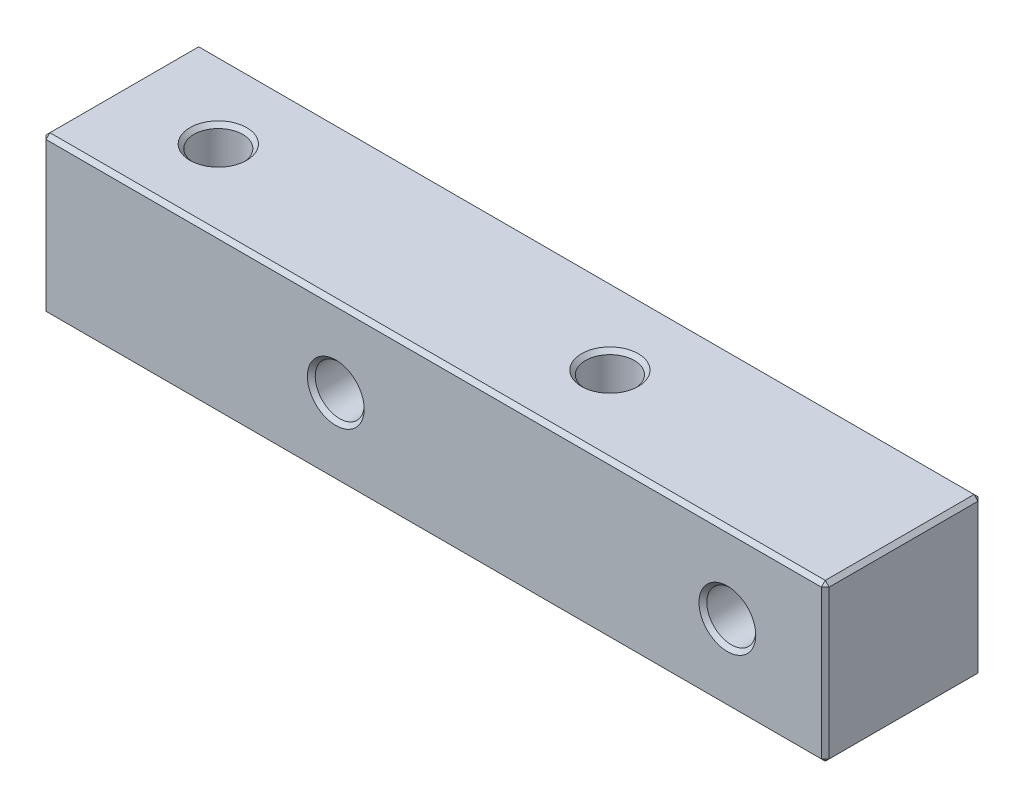
ISO-10303-21;
HEADER;
FILE_DESCRIPTION(('STEP AP214'),'2;1');
FILE_NAME('part.step','',(''),(''),'','','');
FILE_SCHEMA(('AUTOMOTIVE_DESIGN { 1 0 10303 214 1 1 1 1 }'));
ENDSEC;
DATA;
#1=APPLICATION_CONTEXT('core data for automotive mechanical design processes');
#2=APPLICATION_PROTOCOL_DEFINITION('international standard','automotive_design',2000,#1);
#3=PRODUCT_CONTEXT('',#1,'mechanical');
#4=PRODUCT('Part','Part','',(#3));
#5=PRODUCT_RELATED_PRODUCT_CATEGORY('part','',(#4));
#6=PRODUCT_DEFINITION_FORMATION('','',#4);
#7=PRODUCT_DEFINITION_CONTEXT('part definition',#1,'design');
#8=PRODUCT_DEFINITION('design','',#6,#7);
#9=PRODUCT_DEFINITION_SHAPE('','',#8);
#10=(LENGTH_UNIT() NAMED_UNIT(*) SI_UNIT(.MILLI.,.METRE.));
#11=(NAMED_UNIT(*) PLANE_ANGLE_UNIT() SI_UNIT($,.RADIAN.));
#12=(NAMED_UNIT(*) SI_UNIT($,.STERADIAN.) SOLID_ANGLE_UNIT());
#13=UNCERTAINTY_MEASURE_WITH_UNIT(LENGTH_MEASURE(1.E-05),#10,'distance_accuracy_value','');
#14=(GEOMETRIC_REPRESENTATION_CONTEXT(3) GLOBAL_UNCERTAINTY_ASSIGNED_CONTEXT((#13)) GLOBAL_UNIT_ASSIGNED_CONTEXT((#10,
#11,#12)) REPRESENTATION_CONTEXT('',''));
#15=CARTESIAN_POINT('',(0.,0.,0.));
#16=DIRECTION('',(0.,0.,1.));
#17=DIRECTION('',(1.,0.,0.));
#18=AXIS2_PLACEMENT_3D('',#15,#16,#17);
#19=CARTESIAN_POINT('',(20.,4.,-4.));
#20=DIRECTION('',(-1.,0.,0.));
#21=DIRECTION('',(0.,0.,1.));
#22=AXIS2_PLACEMENT_3D('',#19,#20,#21);
#23=PLANE('',#22);
#24=DIRECTION('',(0.,-1.,0.));
#25=VECTOR('',#24,1.);
#26=CARTESIAN_POINT('',(20.,4.,3.8));
#27=LINE('',#26,#25);
#28=CARTESIAN_POINT('',(20.,3.8,3.8));
#29=VERTEX_POINT('',#28);
#30=CARTESIAN_POINT('',(20.,-3.8,3.8));
#31=VERTEX_POINT('',#30);
#32=EDGE_CURVE('E241',#29,#31,#27,.T.);
#33=ORIENTED_EDGE('',*,*,#32,.T.);
#34=DIRECTION('',(0.,0.,-1.));
#35=VECTOR('',#34,1.);
#36=CARTESIAN_POINT('',(20.,-3.8,-4.));
#37=LINE('',#36,#35);
#38=CARTESIAN_POINT('',(20.,-3.8,-3.8));
#39=VERTEX_POINT('',#38);
#40=EDGE_CURVE('E243',#31,#39,#37,.T.);
#41=ORIENTED_EDGE('',*,*,#40,.T.);
#42=DIRECTION('',(0.,1.,0.));
#43=VECTOR('',#42,1.);
#44=CARTESIAN_POINT('',(20.,4.,-3.8));
#45=LINE('',#44,#43);
#46=CARTESIAN_POINT('',(20.,3.8,-3.8));
#47=VERTEX_POINT('',#46);
#48=EDGE_CURVE('E237',#39,#47,#45,.T.);
#49=ORIENTED_EDGE('',*,*,#48,.T.);
#50=DIRECTION('',(0.,0.,1.));
#51=VECTOR('',#50,1.);
#52=CARTESIAN_POINT('',(20.,3.8,4.));
#53=LINE('',#52,#51);
#54=EDGE_CURVE('E239',#47,#29,#53,.T.);
#55=ORIENTED_EDGE('',*,*,#54,.T.);
#56=EDGE_LOOP('',(#33,#41,#49,#55));
#57=FACE_BOUND('',#56,.T.);
#58=ADVANCED_FACE('F41',(#57),#23,.F.);
#59=CARTESIAN_POINT('',(-20.,4.,-4.));
#60=DIRECTION('',(0.,0.,1.));
#61=DIRECTION('',(1.,0.,0.));
#62=AXIS2_PLACEMENT_3D('',#59,#60,#61);
#63=PLANE('',#62);
#64=DIRECTION('',(1.,0.,0.));
#65=VECTOR('',#64,1.);
#66=CARTESIAN_POINT('',(20.,3.8,-4.));
#67=LINE('',#66,#65);
#68=CARTESIAN_POINT('',(-19.8,3.8,-4.));
#69=VERTEX_POINT('',#68);
#70=CARTESIAN_POINT('',(19.8,3.8,-4.));
#71=VERTEX_POINT('',#70);
#72=EDGE_CURVE('E51',#69,#71,#67,.T.);
#73=ORIENTED_EDGE('',*,*,#72,.T.);
#74=DIRECTION('',(0.,-1.,0.));
#75=VECTOR('',#74,1.);
#76=CARTESIAN_POINT('',(19.8,4.,-4.));
#77=LINE('',#76,#75);
#78=CARTESIAN_POINT('',(19.8,-3.8,-4.));
#79=VERTEX_POINT('',#78);
#80=EDGE_CURVE('E11',#71,#79,#77,.T.);
#81=ORIENTED_EDGE('',*,*,#80,.T.);
#82=DIRECTION('',(-1.,0.,0.));
#83=VECTOR('',#82,1.);
#84=CARTESIAN_POINT('',(-20.,-3.8,-4.));
#85=LINE('',#84,#83);
#86=CARTESIAN_POINT('',(-19.8,-3.8,-4.));
#87=VERTEX_POINT('',#86);
#88=EDGE_CURVE('E252',#79,#87,#85,.T.);
#89=ORIENTED_EDGE('',*,*,#88,.T.);
#90=DIRECTION('',(0.,1.,0.));
#91=VECTOR('',#90,1.);
#92=CARTESIAN_POINT('',(-19.8,4.,-4.));
#93=LINE('',#92,#91);
#94=EDGE_CURVE('E62',#87,#69,#93,.T.);
#95=ORIENTED_EDGE('',*,*,#94,.T.);
#96=EDGE_LOOP('',(#73,#81,#89,#95));
#97=FACE_BOUND('',#96,.T.);
#98=CARTESIAN_POINT('',(-5.,0.,-4.));
#99=DIRECTION('',(0.,0.,1.));
#100=DIRECTION('',(1.,0.,0.));
#101=AXIS2_PLACEMENT_3D('',#98,#99,#100);
#102=CIRCLE('',#101,1.44999999999999);
#103=CARTESIAN_POINT('',(-3.55000000000001,0.,-4.));
#104=VERTEX_POINT('',#103);
#105=EDGE_CURVE('E249',#104,#104,#102,.T.);
#106=ORIENTED_EDGE('',*,*,#105,.T.);
#107=EDGE_LOOP('',(#106));
#108=FACE_BOUND('',#107,.T.);
#109=CARTESIAN_POINT('',(15.,0.,-4.));
#110=DIRECTION('',(0.,0.,1.));
#111=DIRECTION('',(1.,0.,0.));
#112=AXIS2_PLACEMENT_3D('',#109,#110,#111);
#113=CIRCLE('',#112,1.44999999999999);
#114=CARTESIAN_POINT('',(16.45,0.,-4.));
#115=VERTEX_POINT('',#114);
#116=EDGE_CURVE('E246',#115,#115,#113,.T.);
#117=ORIENTED_EDGE('',*,*,#116,.T.);
#118=EDGE_LOOP('',(#117));
#119=FACE_BOUND('',#118,.T.);
#120=ADVANCED_FACE('F324',(#97,#108,#119),#63,.F.);
#121=CARTESIAN_POINT('',(-20.,4.,-4.));
#122=DIRECTION('',(1.,0.,0.));
#123=DIRECTION('',(0.,0.,-1.));
#124=AXIS2_PLACEMENT_3D('',#121,#122,#123);
#125=PLANE('',#124);
#126=DIRECTION('',(0.,-1.,0.));
#127=VECTOR('',#126,1.);
#128=CARTESIAN_POINT('',(-20.,4.,-3.8));
#129=LINE('',#128,#127);
#130=CARTESIAN_POINT('',(-20.,3.8,-3.8));
#131=VERTEX_POINT('',#130);
#132=CARTESIAN_POINT('',(-20.,-3.8,-3.8));
#133=VERTEX_POINT('',#132);
#134=EDGE_CURVE('E230',#131,#133,#129,.T.);
#135=ORIENTED_EDGE('',*,*,#134,.T.);
#136=DIRECTION('',(0.,0.,1.));
#137=VECTOR('',#136,1.);
#138=CARTESIAN_POINT('',(-20.,-3.8,-4.));
#139=LINE('',#138,#137);
#140=CARTESIAN_POINT('',(-20.,-3.8,3.8));
#141=VERTEX_POINT('',#140);
#142=EDGE_CURVE('E138',#133,#141,#139,.T.);
#143=ORIENTED_EDGE('',*,*,#142,.T.);
#144=DIRECTION('',(0.,1.,0.));
#145=VECTOR('',#144,1.);
#146=CARTESIAN_POINT('',(-20.,4.,3.8));
#147=LINE('',#146,#145);
#148=CARTESIAN_POINT('',(-20.,3.8,3.8));
#149=VERTEX_POINT('',#148);
#150=EDGE_CURVE('E234',#141,#149,#147,.T.);
#151=ORIENTED_EDGE('',*,*,#150,.T.);
#152=DIRECTION('',(0.,0.,-1.));
#153=VECTOR('',#152,1.);
#154=CARTESIAN_POINT('',(-20.,3.8,-4.));
#155=LINE('',#154,#153);
#156=EDGE_CURVE('E232',#149,#131,#155,.T.);
#157=ORIENTED_EDGE('',*,*,#156,.T.);
#158=EDGE_LOOP('',(#135,#143,#151,#157));
#159=FACE_BOUND('',#158,.T.);
#160=ADVANCED_FACE('F381',(#159),#125,.F.);
#161=CARTESIAN_POINT('',(-20.,4.,4.));
#162=DIRECTION('',(0.,0.,-1.));
#163=DIRECTION('',(-1.,0.,0.));
#164=AXIS2_PLACEMENT_3D('',#161,#162,#163);
#165=PLANE('',#164);
#166=CARTESIAN_POINT('',(-5.,0.,4.));
#167=DIRECTION('',(0.,0.,-1.));
#168=DIRECTION('',(-1.,0.,0.));
#169=AXIS2_PLACEMENT_3D('',#166,#167,#168);
#170=CIRCLE('',#169,1.45);
#171=CARTESIAN_POINT('',(-6.45,0.,4.));
#172=VERTEX_POINT('',#171);
#173=EDGE_CURVE('E200',#172,#172,#170,.T.);
#174=ORIENTED_EDGE('',*,*,#173,.T.);
#175=EDGE_LOOP('',(#174));
#176=FACE_BOUND('',#175,.T.);
#177=CARTESIAN_POINT('',(15.,0.,4.));
#178=DIRECTION('',(0.,0.,-1.));
#179=DIRECTION('',(-1.,0.,0.));
#180=AXIS2_PLACEMENT_3D('',#177,#178,#179);
#181=CIRCLE('',#180,1.44999999999999);
#182=CARTESIAN_POINT('',(16.45,0.,4.));
#183=VERTEX_POINT('',#182);
#184=EDGE_CURVE('E197',#183,#183,#181,.T.);
#185=ORIENTED_EDGE('',*,*,#184,.T.);
#186=EDGE_LOOP('',(#185));
#187=FACE_BOUND('',#186,.T.);
#188=DIRECTION('',(-1.,0.,0.));
#189=VECTOR('',#188,1.);
#190=CARTESIAN_POINT('',(-20.,3.8,4.));
#191=LINE('',#190,#189);
#192=CARTESIAN_POINT('',(19.8,3.8,4.));
#193=VERTEX_POINT('',#192);
#194=CARTESIAN_POINT('',(-19.8,3.8,4.));
#195=VERTEX_POINT('',#194);
#196=EDGE_CURVE('E188',#193,#195,#191,.T.);
#197=ORIENTED_EDGE('',*,*,#196,.T.);
#198=DIRECTION('',(0.,-1.,0.));
#199=VECTOR('',#198,1.);
#200=CARTESIAN_POINT('',(-19.8,4.,4.));
#201=LINE('',#200,#199);
#202=CARTESIAN_POINT('',(-19.8,-3.8,4.));
#203=VERTEX_POINT('',#202);
#204=EDGE_CURVE('E194',#195,#203,#201,.T.);
#205=ORIENTED_EDGE('',*,*,#204,.T.);
#206=DIRECTION('',(1.,0.,0.));
#207=VECTOR('',#206,1.);
#208=CARTESIAN_POINT('',(-20.,-3.8,4.));
#209=LINE('',#208,#207);
#210=CARTESIAN_POINT('',(19.8,-3.8,4.));
#211=VERTEX_POINT('',#210);
#212=EDGE_CURVE('E192',#203,#211,#209,.T.);
#213=ORIENTED_EDGE('',*,*,#212,.T.);
#214=DIRECTION('',(0.,1.,0.));
#215=VECTOR('',#214,1.);
#216=CARTESIAN_POINT('',(19.8,4.,4.));
#217=LINE('',#216,#215);
#218=EDGE_CURVE('E190',#211,#193,#217,.T.);
#219=ORIENTED_EDGE('',*,*,#218,.T.);
#220=EDGE_LOOP('',(#197,#205,#213,#219));
#221=FACE_BOUND('',#220,.T.);
#222=ADVANCED_FACE('F556',(#176,#187,#221),#165,.F.);
#223=CARTESIAN_POINT('',(0.,4.,0.));
#224=DIRECTION('',(0.,1.,0.));
#225=DIRECTION('',(0.,0.,1.));
#226=AXIS2_PLACEMENT_3D('',#223,#224,#225);
#227=PLANE('',#226);
#228=CARTESIAN_POINT('',(5.,4.,0.));
#229=DIRECTION('',(0.,1.,0.));
#230=DIRECTION('',(0.,0.,1.));
#231=AXIS2_PLACEMENT_3D('',#228,#229,#230);
#232=CIRCLE('',#231,1.44999999999999);
#233=CARTESIAN_POINT('',(5.,4.,1.44999999999999));
#234=VERTEX_POINT('',#233);
#235=EDGE_CURVE('E227',#234,#234,#232,.F.);
#236=ORIENTED_EDGE('',*,*,#235,.T.);
#237=EDGE_LOOP('',(#236));
#238=FACE_BOUND('',#237,.T.);
#239=CARTESIAN_POINT('',(-15.,4.,0.));
#240=DIRECTION('',(0.,1.,0.));
#241=DIRECTION('',(0.,0.,1.));
#242=AXIS2_PLACEMENT_3D('',#239,#240,#241);
#243=CIRCLE('',#242,1.44999999999999);
#244=CARTESIAN_POINT('',(-15.,4.,1.44999999999999));
#245=VERTEX_POINT('',#244);
#246=EDGE_CURVE('E224',#245,#245,#243,.F.);
#247=ORIENTED_EDGE('',*,*,#246,.T.);
#248=EDGE_LOOP('',(#247));
#249=FACE_BOUND('',#248,.T.);
#250=DIRECTION('',(0.,0.,1.));
#251=VECTOR('',#250,1.);
#252=CARTESIAN_POINT('',(-19.8,4.,4.));
#253=LINE('',#252,#251);
#254=CARTESIAN_POINT('',(-19.8,4.,-3.8));
#255=VERTEX_POINT('',#254);
#256=CARTESIAN_POINT('',(-19.8,4.,3.8));
#257=VERTEX_POINT('',#256);
#258=EDGE_CURVE('E219',#255,#257,#253,.T.);
#259=ORIENTED_EDGE('',*,*,#258,.T.);
#260=DIRECTION('',(1.,0.,0.));
#261=VECTOR('',#260,1.);
#262=CARTESIAN_POINT('',(20.,4.,3.8));
#263=LINE('',#262,#261);
#264=CARTESIAN_POINT('',(19.8,4.,3.8));
#265=VERTEX_POINT('',#264);
#266=EDGE_CURVE('E221',#257,#265,#263,.T.);
#267=ORIENTED_EDGE('',*,*,#266,.T.);
#268=DIRECTION('',(0.,0.,-1.));
#269=VECTOR('',#268,1.);
#270=CARTESIAN_POINT('',(19.8,4.,-4.));
#271=LINE('',#270,#269);
#272=CARTESIAN_POINT('',(19.8,4.,-3.8));
#273=VERTEX_POINT('',#272);
#274=EDGE_CURVE('E217',#265,#273,#271,.T.);
#275=ORIENTED_EDGE('',*,*,#274,.T.);
#276=DIRECTION('',(-1.,0.,0.));
#277=VECTOR('',#276,1.);
#278=CARTESIAN_POINT('',(-20.,4.,-3.8));
#279=LINE('',#278,#277);
#280=EDGE_CURVE('E215',#273,#255,#279,.T.);
#281=ORIENTED_EDGE('',*,*,#280,.T.);
#282=EDGE_LOOP('',(#259,#267,#275,#281));
#283=FACE_BOUND('',#282,.T.);
#284=ADVANCED_FACE('F338',(#238,#249,#283),#227,.T.);
#285=CARTESIAN_POINT('',(0.,-4.,0.));
#286=DIRECTION('',(0.,1.,0.));
#287=DIRECTION('',(0.,0.,1.));
#288=AXIS2_PLACEMENT_3D('',#285,#286,#287);
#289=PLANE('',#288);
#290=CARTESIAN_POINT('',(5.,-4.,0.));
#291=DIRECTION('',(0.,1.,0.));
#292=DIRECTION('',(0.,0.,1.));
#293=AXIS2_PLACEMENT_3D('',#290,#291,#292);
#294=CIRCLE('',#293,1.44999999999999);
#295=CARTESIAN_POINT('',(5.,-4.,1.44999999999999));
#296=VERTEX_POINT('',#295);
#297=EDGE_CURVE('E173',#296,#296,#294,.T.);
#298=ORIENTED_EDGE('',*,*,#297,.T.);
#299=EDGE_LOOP('',(#298));
#300=FACE_BOUND('',#299,.T.);
#301=CARTESIAN_POINT('',(-15.,-4.,0.));
#302=DIRECTION('',(0.,1.,0.));
#303=DIRECTION('',(0.,0.,1.));
#304=AXIS2_PLACEMENT_3D('',#301,#302,#303);
#305=CIRCLE('',#304,1.45);
#306=CARTESIAN_POINT('',(-15.,-4.,1.45));
#307=VERTEX_POINT('',#306);
#308=EDGE_CURVE('E167',#307,#307,#305,.T.);
#309=ORIENTED_EDGE('',*,*,#308,.T.);
#310=EDGE_LOOP('',(#309));
#311=FACE_BOUND('',#310,.T.);
#312=DIRECTION('',(0.,0.,1.));
#313=VECTOR('',#312,1.);
#314=CARTESIAN_POINT('',(19.8,-4.,0.));
#315=LINE('',#314,#313);
#316=CARTESIAN_POINT('',(19.8,-4.,-3.8));
#317=VERTEX_POINT('',#316);
#318=CARTESIAN_POINT('',(19.8,-4.,3.8));
#319=VERTEX_POINT('',#318);
#320=EDGE_CURVE('E160',#317,#319,#315,.T.);
#321=ORIENTED_EDGE('',*,*,#320,.T.);
#322=DIRECTION('',(-1.,0.,0.));
#323=VECTOR('',#322,1.);
#324=CARTESIAN_POINT('',(0.,-4.,3.8));
#325=LINE('',#324,#323);
#326=CARTESIAN_POINT('',(-19.8,-4.,3.8));
#327=VERTEX_POINT('',#326);
#328=EDGE_CURVE('E164',#319,#327,#325,.T.);
#329=ORIENTED_EDGE('',*,*,#328,.T.);
#330=DIRECTION('',(0.,0.,-1.));
#331=VECTOR('',#330,1.);
#332=CARTESIAN_POINT('',(-19.8,-4.,0.));
#333=LINE('',#332,#331);
#334=CARTESIAN_POINT('',(-19.8,-4.,-3.8));
#335=VERTEX_POINT('',#334);
#336=EDGE_CURVE('E135',#327,#335,#333,.T.);
#337=ORIENTED_EDGE('',*,*,#336,.T.);
#338=DIRECTION('',(1.,0.,0.));
#339=VECTOR('',#338,1.);
#340=CARTESIAN_POINT('',(0.,-4.,-3.8));
#341=LINE('',#340,#339);
#342=EDGE_CURVE('E154',#335,#317,#341,.T.);
#343=ORIENTED_EDGE('',*,*,#342,.T.);
#344=EDGE_LOOP('',(#321,#329,#337,#343));
#345=FACE_BOUND('',#344,.T.);
#346=ADVANCED_FACE('F162',(#300,#311,#345),#289,.F.);
#347=CARTESIAN_POINT('',(5.,4.,0.));
#348=DIRECTION('',(0.,1.,0.));
#349=DIRECTION('',(0.,0.,1.));
#350=AXIS2_PLACEMENT_3D('',#347,#348,#349);
#351=CYLINDRICAL_SURFACE('',#350,1.24999999999999);
#352=CARTESIAN_POINT('',(5.,-3.8,0.));
#353=DIRECTION('',(0.,1.,0.));
#354=DIRECTION('',(0.,0.,1.));
#355=AXIS2_PLACEMENT_3D('',#352,#353,#354);
#356=CIRCLE('',#355,1.24999999999999);
#357=CARTESIAN_POINT('',(5.,-3.8,1.24999999999999));
#358=VERTEX_POINT('',#357);
#359=EDGE_CURVE('E179',#358,#358,#356,.F.);
#360=ORIENTED_EDGE('',*,*,#359,.T.);
#361=EDGE_LOOP('',(#360));
#362=FACE_BOUND('',#361,.T.);
#363=CARTESIAN_POINT('',(5.,3.80000000000001,0.));
#364=DIRECTION('',(0.,1.,0.));
#365=DIRECTION('',(0.,0.,1.));
#366=AXIS2_PLACEMENT_3D('',#363,#364,#365);
#367=CIRCLE('',#366,1.24999999999999);
#368=CARTESIAN_POINT('',(5.,3.80000000000001,1.24999999999999));
#369=VERTEX_POINT('',#368);
#370=EDGE_CURVE('E176',#369,#369,#367,.T.);
#371=ORIENTED_EDGE('',*,*,#370,.T.);
#372=EDGE_LOOP('',(#371));
#373=FACE_BOUND('',#372,.T.);
#374=ADVANCED_FACE('F547',(#362,#373),#351,.F.);
#375=CARTESIAN_POINT('',(-15.,4.,0.));
#376=DIRECTION('',(0.,1.,0.));
#377=DIRECTION('',(0.,0.,1.));
#378=AXIS2_PLACEMENT_3D('',#375,#376,#377);
#379=CYLINDRICAL_SURFACE('',#378,1.24999999999999);
#380=CARTESIAN_POINT('',(-15.,-3.79999999999999,0.));
#381=DIRECTION('',(0.,1.,0.));
#382=DIRECTION('',(0.,0.,1.));
#383=AXIS2_PLACEMENT_3D('',#380,#381,#382);
#384=CIRCLE('',#383,1.24999999999999);
#385=CARTESIAN_POINT('',(-15.,-3.79999999999999,1.24999999999999));
#386=VERTEX_POINT('',#385);
#387=EDGE_CURVE('E185',#386,#386,#384,.F.);
#388=ORIENTED_EDGE('',*,*,#387,.T.);
#389=EDGE_LOOP('',(#388));
#390=FACE_BOUND('',#389,.T.);
#391=CARTESIAN_POINT('',(-15.,3.80000000000001,0.));
#392=DIRECTION('',(0.,1.,0.));
#393=DIRECTION('',(0.,0.,1.));
#394=AXIS2_PLACEMENT_3D('',#391,#392,#393);
#395=CIRCLE('',#394,1.24999999999999);
#396=CARTESIAN_POINT('',(-15.,3.80000000000001,1.24999999999999));
#397=VERTEX_POINT('',#396);
#398=EDGE_CURVE('E182',#397,#397,#395,.T.);
#399=ORIENTED_EDGE('',*,*,#398,.T.);
#400=EDGE_LOOP('',(#399));
#401=FACE_BOUND('',#400,.T.);
#402=ADVANCED_FACE('F538',(#390,#401),#379,.F.);
#403=CARTESIAN_POINT('',(-5.,0.,-4.));
#404=DIRECTION('',(0.,0.,-1.));
#405=DIRECTION('',(-1.,0.,0.));
#406=AXIS2_PLACEMENT_3D('',#403,#404,#405);
#407=CYLINDRICAL_SURFACE('',#406,1.24999999999999);
#408=CARTESIAN_POINT('',(-5.,0.,3.8));
#409=DIRECTION('',(0.,0.,-1.));
#410=DIRECTION('',(-1.,0.,0.));
#411=AXIS2_PLACEMENT_3D('',#408,#409,#410);
#412=CIRCLE('',#411,1.24999999999999);
#413=CARTESIAN_POINT('',(-6.24999999999999,0.,3.8));
#414=VERTEX_POINT('',#413);
#415=EDGE_CURVE('E206',#414,#414,#412,.F.);
#416=ORIENTED_EDGE('',*,*,#415,.T.);
#417=EDGE_LOOP('',(#416));
#418=FACE_BOUND('',#417,.T.);
#419=CARTESIAN_POINT('',(-5.,0.,-3.80000000000001));
#420=DIRECTION('',(0.,0.,1.));
#421=DIRECTION('',(1.,0.,0.));
#422=AXIS2_PLACEMENT_3D('',#419,#420,#421);
#423=CIRCLE('',#422,1.24999999999999);
#424=CARTESIAN_POINT('',(-3.75000000000001,0.,-3.80000000000001));
#425=VERTEX_POINT('',#424);
#426=EDGE_CURVE('E203',#425,#425,#423,.F.);
#427=ORIENTED_EDGE('',*,*,#426,.T.);
#428=EDGE_LOOP('',(#427));
#429=FACE_BOUND('',#428,.T.);
#430=ADVANCED_FACE('F536',(#418,#429),#407,.F.);
#431=CARTESIAN_POINT('',(15.,0.,-4.));
#432=DIRECTION('',(0.,0.,-1.));
#433=DIRECTION('',(-1.,0.,0.));
#434=AXIS2_PLACEMENT_3D('',#431,#432,#433);
#435=CYLINDRICAL_SURFACE('',#434,1.24999999999999);
#436=CARTESIAN_POINT('',(15.,0.,3.80000000000001));
#437=DIRECTION('',(0.,0.,-1.));
#438=DIRECTION('',(-1.,0.,0.));
#439=AXIS2_PLACEMENT_3D('',#436,#437,#438);
#440=CIRCLE('',#439,1.24999999999999);
#441=CARTESIAN_POINT('',(16.25,0.,3.80000000000001));
#442=VERTEX_POINT('',#441);
#443=EDGE_CURVE('E212',#442,#442,#440,.F.);
#444=ORIENTED_EDGE('',*,*,#443,.T.);
#445=EDGE_LOOP('',(#444));
#446=FACE_BOUND('',#445,.T.);
#447=CARTESIAN_POINT('',(15.,0.,-3.80000000000001));
#448=DIRECTION('',(0.,0.,1.));
#449=DIRECTION('',(1.,0.,0.));
#450=AXIS2_PLACEMENT_3D('',#447,#448,#449);
#451=CIRCLE('',#450,1.24999999999999);
#452=CARTESIAN_POINT('',(16.25,0.,-3.80000000000001));
#453=VERTEX_POINT('',#452);
#454=EDGE_CURVE('E209',#453,#453,#451,.F.);
#455=ORIENTED_EDGE('',*,*,#454,.T.);
#456=EDGE_LOOP('',(#455));
#457=FACE_BOUND('',#456,.T.);
#458=ADVANCED_FACE('F393',(#446,#457),#435,.F.);
#459=CARTESIAN_POINT('',(5.,-4.,0.));
#460=DIRECTION('',(0.,-1.,0.));
#461=DIRECTION('',(0.,0.,-1.));
#462=AXIS2_PLACEMENT_3D('',#459,#460,#461);
#463=CONICAL_SURFACE('',#462,1.44999999999999,0.785398163397448);
#464=ORIENTED_EDGE('',*,*,#359,.F.);
#465=EDGE_LOOP('',(#464));
#466=FACE_BOUND('',#465,.T.);
#467=ORIENTED_EDGE('',*,*,#297,.F.);
#468=EDGE_LOOP('',(#467));
#469=FACE_BOUND('',#468,.T.);
#470=ADVANCED_FACE('F386',(#466,#469),#463,.F.);
#471=CARTESIAN_POINT('',(-15.,-4.,0.));
#472=DIRECTION('',(0.,-1.,0.));
#473=DIRECTION('',(0.,0.,-1.));
#474=AXIS2_PLACEMENT_3D('',#471,#472,#473);
#475=CONICAL_SURFACE('',#474,1.45,0.785398163397448);
#476=ORIENTED_EDGE('',*,*,#387,.F.);
#477=EDGE_LOOP('',(#476));
#478=FACE_BOUND('',#477,.T.);
#479=ORIENTED_EDGE('',*,*,#308,.F.);
#480=EDGE_LOOP('',(#479));
#481=FACE_BOUND('',#480,.T.);
#482=ADVANCED_FACE('F392',(#478,#481),#475,.F.);
#483=CARTESIAN_POINT('',(-5.,0.,4.));
#484=DIRECTION('',(0.,0.,1.));
#485=DIRECTION('',(1.,0.,0.));
#486=AXIS2_PLACEMENT_3D('',#483,#484,#485);
#487=CONICAL_SURFACE('',#486,1.45,0.785398163397448);
#488=ORIENTED_EDGE('',*,*,#415,.F.);
#489=EDGE_LOOP('',(#488));
#490=FACE_BOUND('',#489,.T.);
#491=ORIENTED_EDGE('',*,*,#173,.F.);
#492=EDGE_LOOP('',(#491));
#493=FACE_BOUND('',#492,.T.);
#494=ADVANCED_FACE('F400',(#490,#493),#487,.F.);
#495=CARTESIAN_POINT('',(15.,0.,4.));
#496=DIRECTION('',(0.,0.,1.));
#497=DIRECTION('',(1.,0.,0.));
#498=AXIS2_PLACEMENT_3D('',#495,#496,#497);
#499=CONICAL_SURFACE('',#498,1.44999999999999,0.785398163397446);
#500=CARTESIAN_POINT('',(16.25,0.,3.80000000000001));
#501=CARTESIAN_POINT('',(16.2520833333333,0.,3.80208333333334));
#502=CARTESIAN_POINT('',(16.2541666666667,0.,3.80416666666667));
#503=CARTESIAN_POINT('',(16.2583333333333,0.,3.80833333333334));
#504=CARTESIAN_POINT('',(16.2604166666667,0.,3.81041666666667));
#505=CARTESIAN_POINT('',(16.2645833333333,0.,3.81458333333334));
#506=CARTESIAN_POINT('',(16.2666666666667,0.,3.81666666666667));
#507=CARTESIAN_POINT('',(16.2708333333333,0.,3.82083333333334));
#508=CARTESIAN_POINT('',(16.2729166666667,0.,3.82291666666667));
#509=CARTESIAN_POINT('',(16.2770833333333,0.,3.82708333333334));
#510=CARTESIAN_POINT('',(16.2791666666667,0.,3.82916666666667));
#511=CARTESIAN_POINT('',(16.2833333333333,0.,3.83333333333334));
#512=CARTESIAN_POINT('',(16.2854166666667,0.,3.83541666666667));
#513=CARTESIAN_POINT('',(16.2895833333333,0.,3.83958333333334));
#514=CARTESIAN_POINT('',(16.2916666666667,0.,3.84166666666667));
#515=CARTESIAN_POINT('',(16.2958333333333,0.,3.84583333333334));
#516=CARTESIAN_POINT('',(16.2979166666667,0.,3.84791666666667));
#517=CARTESIAN_POINT('',(16.3020833333333,0.,3.85208333333334));
#518=CARTESIAN_POINT('',(16.3041666666667,0.,3.85416666666667));
#519=CARTESIAN_POINT('',(16.3083333333333,0.,3.85833333333334));
#520=CARTESIAN_POINT('',(16.3104166666667,0.,3.86041666666667));
#521=CARTESIAN_POINT('',(16.3145833333333,0.,3.86458333333334));
#522=CARTESIAN_POINT('',(16.3166666666667,0.,3.86666666666667));
#523=CARTESIAN_POINT('',(16.3208333333333,0.,3.87083333333334));
#524=CARTESIAN_POINT('',(16.3229166666667,0.,3.87291666666667));
#525=CARTESIAN_POINT('',(16.3270833333333,0.,3.87708333333334));
#526=CARTESIAN_POINT('',(16.3291666666667,0.,3.87916666666667));
#527=CARTESIAN_POINT('',(16.3333333333333,0.,3.88333333333334));
#528=CARTESIAN_POINT('',(16.3354166666667,0.,3.88541666666667));
#529=CARTESIAN_POINT('',(16.3395833333333,0.,3.88958333333334));
#530=CARTESIAN_POINT('',(16.3416666666667,0.,3.89166666666667));
#531=CARTESIAN_POINT('',(16.3458333333333,0.,3.89583333333334));
#532=CARTESIAN_POINT('',(16.3479166666667,0.,3.89791666666667));
#533=CARTESIAN_POINT('',(16.3520833333333,0.,3.90208333333334));
#534=CARTESIAN_POINT('',(16.3541666666667,0.,3.90416666666667));
#535=CARTESIAN_POINT('',(16.3583333333333,0.,3.90833333333334));
#536=CARTESIAN_POINT('',(16.3604166666667,0.,3.91041666666667));
#537=CARTESIAN_POINT('',(16.3645833333333,0.,3.91458333333334));
#538=CARTESIAN_POINT('',(16.3666666666667,0.,3.91666666666667));
#539=CARTESIAN_POINT('',(16.3708333333333,0.,3.92083333333334));
#540=CARTESIAN_POINT('',(16.3729166666667,0.,3.92291666666667));
#541=CARTESIAN_POINT('',(16.3770833333333,0.,3.92708333333334));
#542=CARTESIAN_POINT('',(16.3791666666667,0.,3.92916666666667));
#543=CARTESIAN_POINT('',(16.3833333333333,0.,3.93333333333334));
#544=CARTESIAN_POINT('',(16.3854166666667,0.,3.93541666666667));
#545=CARTESIAN_POINT('',(16.3895833333333,0.,3.93958333333334));
#546=CARTESIAN_POINT('',(16.3916666666667,0.,3.94166666666667));
#547=CARTESIAN_POINT('',(16.3958333333333,0.,3.94583333333334));
#548=CARTESIAN_POINT('',(16.3979166666667,0.,3.94791666666667));
#549=CARTESIAN_POINT('',(16.4020833333333,0.,3.95208333333334));
#550=CARTESIAN_POINT('',(16.4041666666667,0.,3.95416666666667));
#551=CARTESIAN_POINT('',(16.4083333333333,0.,3.95833333333334));
#552=CARTESIAN_POINT('',(16.4104166666667,0.,3.96041666666667));
#553=CARTESIAN_POINT('',(16.4145833333333,0.,3.96458333333334));
#554=CARTESIAN_POINT('',(16.4166666666667,0.,3.96666666666667));
#555=CARTESIAN_POINT('',(16.4208333333333,0.,3.97083333333334));
#556=CARTESIAN_POINT('',(16.4229166666667,0.,3.97291666666667));
#557=CARTESIAN_POINT('',(16.4270833333333,0.,3.97708333333334));
#558=CARTESIAN_POINT('',(16.4291666666667,0.,3.97916666666667));
#559=CARTESIAN_POINT('',(16.4333333333333,0.,3.98333333333334));
#560=CARTESIAN_POINT('',(16.4354166666667,0.,3.98541666666667));
#561=CARTESIAN_POINT('',(16.4395833333333,0.,3.98958333333333));
#562=CARTESIAN_POINT('',(16.4416666666667,0.,3.99166666666667));
#563=CARTESIAN_POINT('',(16.4458333333333,0.,3.99583333333333));
#564=CARTESIAN_POINT('',(16.4479166666667,0.,3.99791666666667));
#565=CARTESIAN_POINT('',(16.45,0.,4.));
#566=B_SPLINE_CURVE_WITH_KNOTS('',3,(#500,#501,#502,#503,#504,#505,#506,#507,#508,#509,#510,
#511,#512,#513,#514,#515,#516,#517,#518,#519,#520,#521,#522,#523,#524,#525,#526,#527,#528,#529,
#530,#531,#532,#533,#534,#535,#536,#537,#538,#539,#540,#541,#542,#543,#544,#545,#546,#547,#548,
#549,#550,#551,#552,#553,#554,#555,#556,#557,#558,#559,#560,#561,#562,#563,#564,#565),
.UNSPECIFIED.,.F.,.F.,(4,2,2,2,2,2,2,2,2,2,2,2,2,2,2,2,2,2,2,2,2,2,2,2,2,2,2,2,2,2,2,2,4),(0.,
0.00883883476483118,0.0176776695296624,0.0265165042944935,0.0353553390593247,0.0441941738241562,
0.0530330085889874,0.061871843353821,0.0707106781186522,0.0795495128834834,0.0883883476483149,
0.097227182413146,0.106066017177977,0.114904851942808,0.123743686707642,0.132582521472473,
0.141421356237305,0.150260191002136,0.159099025766967,0.167937860531798,0.176776695296629,
0.185615530061463,0.194454364826295,0.203293199591126,0.212132034355957,0.220970869120788,
0.229809703885619,0.238648538650451,0.247487373415284,0.256326208180116,0.265165042944947,
0.274003877709778,0.282842712474609),.UNSPECIFIED.);
#567=EDGE_CURVE('BSEAM407',#442,#183,#566,.T.);
#568=ORIENTED_EDGE('',*,*,#443,.F.);
#569=ORIENTED_EDGE('',*,*,#184,.F.);
#570=ORIENTED_EDGE('',*,*,#567,.T.);
#571=ORIENTED_EDGE('',*,*,#567,.F.);
#572=EDGE_LOOP('',(#568,#570,#569,#571));
#573=FACE_BOUND('',#572,.T.);
#574=ADVANCED_FACE('F407',(#573),#499,.F.);
#575=CARTESIAN_POINT('',(5.,3.80000000000001,0.));
#576=DIRECTION('',(0.,1.,0.));
#577=DIRECTION('',(0.,0.,1.));
#578=AXIS2_PLACEMENT_3D('',#575,#576,#577);
#579=CONICAL_SURFACE('',#578,1.24999999999999,0.785398163397457);
#580=ORIENTED_EDGE('',*,*,#235,.F.);
#581=EDGE_LOOP('',(#580));
#582=FACE_BOUND('',#581,.T.);
#583=ORIENTED_EDGE('',*,*,#370,.F.);
#584=EDGE_LOOP('',(#583));
#585=FACE_BOUND('',#584,.T.);
#586=ADVANCED_FACE('F414',(#582,#585),#579,.F.);
#587=CARTESIAN_POINT('',(-15.,3.80000000000001,0.));
#588=DIRECTION('',(0.,1.,0.));
#589=DIRECTION('',(0.,0.,1.));
#590=AXIS2_PLACEMENT_3D('',#587,#588,#589);
#591=CONICAL_SURFACE('',#590,1.24999999999999,0.785398163397457);
#592=ORIENTED_EDGE('',*,*,#246,.F.);
#593=EDGE_LOOP('',(#592));
#594=FACE_BOUND('',#593,.T.);
#595=ORIENTED_EDGE('',*,*,#398,.F.);
#596=EDGE_LOOP('',(#595));
#597=FACE_BOUND('',#596,.T.);
#598=ADVANCED_FACE('F421',(#594,#597),#591,.F.);
#599=CARTESIAN_POINT('',(19.8,4.,0.));
#600=DIRECTION('',(0.707106781186548,0.707106781186548,0.));
#601=DIRECTION('',(0.,0.,1.));
#602=AXIS2_PLACEMENT_3D('',#599,#600,#601);
#603=PLANE('',#602);
#604=DIRECTION('',(0.707106781186547,-0.707106781186547,0.));
#605=VECTOR('',#604,1.);
#606=CARTESIAN_POINT('',(19.8,4.,-3.8));
#607=LINE('',#606,#605);
#608=EDGE_CURVE('E46',#273,#47,#607,.T.);
#609=ORIENTED_EDGE('',*,*,#608,.F.);
#610=ORIENTED_EDGE('',*,*,#274,.F.);
#611=DIRECTION('',(-0.707106781186547,0.707106781186547,0.));
#612=VECTOR('',#611,1.);
#613=CARTESIAN_POINT('',(19.9,3.9,3.8));
#614=LINE('',#613,#612);
#615=EDGE_CURVE('E303',#29,#265,#614,.T.);
#616=ORIENTED_EDGE('',*,*,#615,.F.);
#617=ORIENTED_EDGE('',*,*,#54,.F.);
#618=EDGE_LOOP('',(#609,#610,#616,#617));
#619=FACE_BOUND('',#618,.T.);
#620=ADVANCED_FACE('F428',(#619),#603,.T.);
#621=CARTESIAN_POINT('',(19.8,4.,-3.8));
#622=DIRECTION('',(0.577350269189626,0.577350269189626,-0.577350269189626));
#623=DIRECTION('',(-0.707106781186548,0.,-0.707106781186548));
#624=AXIS2_PLACEMENT_3D('',#621,#622,#623);
#625=PLANE('',#624);
#626=DIRECTION('',(0.,0.707106781186547,0.707106781186547));
#627=VECTOR('',#626,1.);
#628=CARTESIAN_POINT('',(19.8,4.,-3.8));
#629=LINE('',#628,#627);
#630=EDGE_CURVE('E299',#273,#71,#629,.F.);
#631=ORIENTED_EDGE('',*,*,#630,.F.);
#632=ORIENTED_EDGE('',*,*,#608,.T.);
#633=DIRECTION('',(0.707106781186547,0.,0.707106781186547));
#634=VECTOR('',#633,1.);
#635=CARTESIAN_POINT('',(19.9,3.8,-3.9));
#636=LINE('',#635,#634);
#637=EDGE_CURVE('E301',#71,#47,#636,.T.);
#638=ORIENTED_EDGE('',*,*,#637,.F.);
#639=EDGE_LOOP('',(#631,#632,#638));
#640=FACE_BOUND('',#639,.T.);
#641=ADVANCED_FACE('F315',(#640),#625,.T.);
#642=CARTESIAN_POINT('',(19.8,3.8,4.));
#643=DIRECTION('',(0.577350269189626,0.577350269189626,0.577350269189626));
#644=DIRECTION('',(0.707106781186548,0.,-0.707106781186548));
#645=AXIS2_PLACEMENT_3D('',#642,#643,#644);
#646=PLANE('',#645);
#647=DIRECTION('',(-0.707106781186547,0.,0.707106781186547));
#648=VECTOR('',#647,1.);
#649=CARTESIAN_POINT('',(19.8,3.8,4.));
#650=LINE('',#649,#648);
#651=EDGE_CURVE('E294',#29,#193,#650,.T.);
#652=ORIENTED_EDGE('',*,*,#651,.F.);
#653=ORIENTED_EDGE('',*,*,#615,.T.);
#654=DIRECTION('',(0.,-0.707106781186547,0.707106781186547));
#655=VECTOR('',#654,1.);
#656=CARTESIAN_POINT('',(19.8,3.8,4.));
#657=LINE('',#656,#655);
#658=EDGE_CURVE('E297',#193,#265,#657,.F.);
#659=ORIENTED_EDGE('',*,*,#658,.F.);
#660=EDGE_LOOP('',(#652,#653,#659));
#661=FACE_BOUND('',#660,.T.);
#662=ADVANCED_FACE('F352',(#661),#646,.T.);
#663=CARTESIAN_POINT('',(19.8,4.,-4.));
#664=DIRECTION('',(-0.707106781186548,0.,0.707106781186548));
#665=DIRECTION('',(0.,-1.,0.));
#666=AXIS2_PLACEMENT_3D('',#663,#664,#665);
#667=PLANE('',#666);
#668=ORIENTED_EDGE('',*,*,#637,.T.);
#669=ORIENTED_EDGE('',*,*,#48,.F.);
#670=DIRECTION('',(-0.707106781186547,0.,-0.707106781186547));
#671=VECTOR('',#670,1.);
#672=CARTESIAN_POINT('',(20.,-3.8,-3.8));
#673=LINE('',#672,#671);
#674=EDGE_CURVE('E289',#79,#39,#673,.F.);
#675=ORIENTED_EDGE('',*,*,#674,.F.);
#676=ORIENTED_EDGE('',*,*,#80,.F.);
#677=EDGE_LOOP('',(#668,#669,#675,#676));
#678=FACE_BOUND('',#677,.T.);
#679=ADVANCED_FACE('F322',(#678),#667,.F.);
#680=CARTESIAN_POINT('',(0.,4.,-3.8));
#681=DIRECTION('',(0.,0.707106781186548,-0.707106781186548));
#682=DIRECTION('',(1.,0.,0.));
#683=AXIS2_PLACEMENT_3D('',#680,#681,#682);
#684=PLANE('',#683);
#685=ORIENTED_EDGE('',*,*,#630,.T.);
#686=ORIENTED_EDGE('',*,*,#72,.F.);
#687=DIRECTION('',(0.,-0.707106781186547,-0.707106781186547));
#688=VECTOR('',#687,1.);
#689=CARTESIAN_POINT('',(-19.8,3.9,-3.9));
#690=LINE('',#689,#688);
#691=EDGE_CURVE('E286',#255,#69,#690,.T.);
#692=ORIENTED_EDGE('',*,*,#691,.F.);
#693=ORIENTED_EDGE('',*,*,#280,.F.);
#694=EDGE_LOOP('',(#685,#686,#692,#693));
#695=FACE_BOUND('',#694,.T.);
#696=ADVANCED_FACE('F335',(#695),#684,.T.);
#697=CARTESIAN_POINT('',(-19.8,4.,0.));
#698=DIRECTION('',(-0.707106781186548,0.707106781186548,0.));
#699=DIRECTION('',(0.,0.,-1.));
#700=AXIS2_PLACEMENT_3D('',#697,#698,#699);
#701=PLANE('',#700);
#702=DIRECTION('',(-0.707106781186547,-0.707106781186547,0.));
#703=VECTOR('',#702,1.);
#704=CARTESIAN_POINT('',(-20.,3.8,3.8));
#705=LINE('',#704,#703);
#706=EDGE_CURVE('E280',#257,#149,#705,.T.);
#707=ORIENTED_EDGE('',*,*,#706,.F.);
#708=ORIENTED_EDGE('',*,*,#258,.F.);
#709=DIRECTION('',(0.707106781186547,0.707106781186547,0.));
#710=VECTOR('',#709,1.);
#711=CARTESIAN_POINT('',(-20.,3.8,-3.8));
#712=LINE('',#711,#710);
#713=EDGE_CURVE('E283',#131,#255,#712,.T.);
#714=ORIENTED_EDGE('',*,*,#713,.F.);
#715=ORIENTED_EDGE('',*,*,#156,.F.);
#716=EDGE_LOOP('',(#707,#708,#714,#715));
#717=FACE_BOUND('',#716,.T.);
#718=ADVANCED_FACE('F342',(#717),#701,.T.);
#719=CARTESIAN_POINT('',(0.,4.,3.8));
#720=DIRECTION('',(0.,0.707106781186548,0.707106781186548));
#721=DIRECTION('',(-1.,0.,0.));
#722=AXIS2_PLACEMENT_3D('',#719,#720,#721);
#723=PLANE('',#722);
#724=ORIENTED_EDGE('',*,*,#658,.T.);
#725=ORIENTED_EDGE('',*,*,#266,.F.);
#726=DIRECTION('',(0.,0.707106781186547,-0.707106781186547));
#727=VECTOR('',#726,1.);
#728=CARTESIAN_POINT('',(-19.8,3.9,3.9));
#729=LINE('',#728,#727);
#730=EDGE_CURVE('E277',#195,#257,#729,.T.);
#731=ORIENTED_EDGE('',*,*,#730,.F.);
#732=ORIENTED_EDGE('',*,*,#196,.F.);
#733=EDGE_LOOP('',(#724,#725,#731,#732));
#734=FACE_BOUND('',#733,.T.);
#735=ADVANCED_FACE('F351',(#734),#723,.T.);
#736=CARTESIAN_POINT('',(20.,4.,3.8));
#737=DIRECTION('',(-0.707106781186548,0.,-0.707106781186548));
#738=DIRECTION('',(0.,-1.,0.));
#739=AXIS2_PLACEMENT_3D('',#736,#737,#738);
#740=PLANE('',#739);
#741=ORIENTED_EDGE('',*,*,#651,.T.);
#742=ORIENTED_EDGE('',*,*,#218,.F.);
#743=DIRECTION('',(0.707106781186547,0.,-0.707106781186547));
#744=VECTOR('',#743,1.);
#745=CARTESIAN_POINT('',(19.9,-3.8,3.9));
#746=LINE('',#745,#744);
#747=EDGE_CURVE('E274',#31,#211,#746,.F.);
#748=ORIENTED_EDGE('',*,*,#747,.F.);
#749=ORIENTED_EDGE('',*,*,#32,.F.);
#750=EDGE_LOOP('',(#741,#742,#748,#749));
#751=FACE_BOUND('',#750,.T.);
#752=ADVANCED_FACE('F357',(#751),#740,.F.);
#753=CARTESIAN_POINT('',(20.,-3.8,-4.));
#754=DIRECTION('',(-0.707106781186548,0.707106781186548,0.));
#755=DIRECTION('',(0.,0.,-1.));
#756=AXIS2_PLACEMENT_3D('',#753,#754,#755);
#757=PLANE('',#756);
#758=DIRECTION('',(0.707106781186547,0.707106781186547,0.));
#759=VECTOR('',#758,1.);
#760=CARTESIAN_POINT('',(20.,-3.8,-3.8));
#761=LINE('',#760,#759);
#762=EDGE_CURVE('E291',#39,#317,#761,.F.);
#763=ORIENTED_EDGE('',*,*,#762,.F.);
#764=ORIENTED_EDGE('',*,*,#40,.F.);
#765=DIRECTION('',(-0.707106781186547,-0.707106781186547,0.));
#766=VECTOR('',#765,1.);
#767=CARTESIAN_POINT('',(19.8,-4.,3.8));
#768=LINE('',#767,#766);
#769=EDGE_CURVE('E271',#319,#31,#768,.F.);
#770=ORIENTED_EDGE('',*,*,#769,.F.);
#771=ORIENTED_EDGE('',*,*,#320,.F.);
#772=EDGE_LOOP('',(#763,#764,#770,#771));
#773=FACE_BOUND('',#772,.T.);
#774=ADVANCED_FACE('F363',(#773),#757,.F.);
#775=CARTESIAN_POINT('',(20.,-3.8,-3.8));
#776=DIRECTION('',(0.577350269189626,-0.577350269189626,-0.577350269189626));
#777=DIRECTION('',(-0.707106781186548,0.,-0.707106781186548));
#778=AXIS2_PLACEMENT_3D('',#775,#776,#777);
#779=PLANE('',#778);
#780=ORIENTED_EDGE('',*,*,#674,.T.);
#781=ORIENTED_EDGE('',*,*,#762,.T.);
#782=DIRECTION('',(0.,-0.707106781186547,0.707106781186547));
#783=VECTOR('',#782,1.);
#784=CARTESIAN_POINT('',(19.8,-3.9,-3.9));
#785=LINE('',#784,#783);
#786=EDGE_CURVE('E157',#79,#317,#785,.T.);
#787=ORIENTED_EDGE('',*,*,#786,.F.);
#788=EDGE_LOOP('',(#780,#781,#787));
#789=FACE_BOUND('',#788,.T.);
#790=ADVANCED_FACE('F366',(#789),#779,.T.);
#791=CARTESIAN_POINT('',(-20.,3.8,-3.8));
#792=DIRECTION('',(-0.577350269189626,0.577350269189626,-0.577350269189626));
#793=DIRECTION('',(-0.707106781186548,0.,0.707106781186548));
#794=AXIS2_PLACEMENT_3D('',#791,#792,#793);
#795=PLANE('',#794);
#796=ORIENTED_EDGE('',*,*,#713,.T.);
#797=ORIENTED_EDGE('',*,*,#691,.T.);
#798=DIRECTION('',(0.707106781186547,0.,-0.707106781186547));
#799=VECTOR('',#798,1.);
#800=CARTESIAN_POINT('',(-20.,3.8,-3.8));
#801=LINE('',#800,#799);
#802=EDGE_CURVE('E267',#131,#69,#801,.T.);
#803=ORIENTED_EDGE('',*,*,#802,.F.);
#804=EDGE_LOOP('',(#796,#797,#803));
#805=FACE_BOUND('',#804,.T.);
#806=ADVANCED_FACE('F331',(#805),#795,.T.);
#807=CARTESIAN_POINT('',(-20.,3.8,3.8));
#808=DIRECTION('',(-0.577350269189626,0.577350269189626,0.577350269189626));
#809=DIRECTION('',(0.707106781186548,0.,0.707106781186548));
#810=AXIS2_PLACEMENT_3D('',#807,#808,#809);
#811=PLANE('',#810);
#812=ORIENTED_EDGE('',*,*,#730,.T.);
#813=ORIENTED_EDGE('',*,*,#706,.T.);
#814=DIRECTION('',(-0.707106781186547,0.,-0.707106781186547));
#815=VECTOR('',#814,1.);
#816=CARTESIAN_POINT('',(-20.,3.8,3.8));
#817=LINE('',#816,#815);
#818=EDGE_CURVE('E264',#195,#149,#817,.T.);
#819=ORIENTED_EDGE('',*,*,#818,.F.);
#820=EDGE_LOOP('',(#812,#813,#819));
#821=FACE_BOUND('',#820,.T.);
#822=ADVANCED_FACE('F347',(#821),#811,.T.);
#823=CARTESIAN_POINT('',(19.8,-4.,3.8));
#824=DIRECTION('',(0.577350269189626,-0.577350269189626,0.577350269189626));
#825=DIRECTION('',(0.707106781186548,0.,-0.707106781186548));
#826=AXIS2_PLACEMENT_3D('',#823,#824,#825);
#827=PLANE('',#826);
#828=ORIENTED_EDGE('',*,*,#769,.T.);
#829=ORIENTED_EDGE('',*,*,#747,.T.);
#830=DIRECTION('',(0.,0.707106781186547,0.707106781186547));
#831=VECTOR('',#830,1.);
#832=CARTESIAN_POINT('',(19.8,-4.,3.8));
#833=LINE('',#832,#831);
#834=EDGE_CURVE('E151',#319,#211,#833,.T.);
#835=ORIENTED_EDGE('',*,*,#834,.F.);
#836=EDGE_LOOP('',(#828,#829,#835));
#837=FACE_BOUND('',#836,.T.);
#838=ADVANCED_FACE('F474',(#837),#827,.T.);
#839=CARTESIAN_POINT('',(-20.,-3.8,-4.));
#840=DIRECTION('',(0.,0.707106781186548,0.707106781186548));
#841=DIRECTION('',(-1.,0.,0.));
#842=AXIS2_PLACEMENT_3D('',#839,#840,#841);
#843=PLANE('',#842);
#844=ORIENTED_EDGE('',*,*,#786,.T.);
#845=ORIENTED_EDGE('',*,*,#342,.F.);
#846=DIRECTION('',(0.,0.707106781186547,-0.707106781186547));
#847=VECTOR('',#846,1.);
#848=CARTESIAN_POINT('',(-19.8,-4.,-3.8));
#849=LINE('',#848,#847);
#850=EDGE_CURVE('E145',#87,#335,#849,.F.);
#851=ORIENTED_EDGE('',*,*,#850,.F.);
#852=ORIENTED_EDGE('',*,*,#88,.F.);
#853=EDGE_LOOP('',(#844,#845,#851,#852));
#854=FACE_BOUND('',#853,.T.);
#855=ADVANCED_FACE('F155',(#854),#843,.F.);
#856=CARTESIAN_POINT('',(-20.,4.,-3.8));
#857=DIRECTION('',(0.707106781186548,0.,0.707106781186548));
#858=DIRECTION('',(0.,-1.,0.));
#859=AXIS2_PLACEMENT_3D('',#856,#857,#858);
#860=PLANE('',#859);
#861=ORIENTED_EDGE('',*,*,#802,.T.);
#862=ORIENTED_EDGE('',*,*,#94,.F.);
#863=DIRECTION('',(-0.707106781186547,0.,0.707106781186547));
#864=VECTOR('',#863,1.);
#865=CARTESIAN_POINT('',(-19.9,-3.8,-3.9));
#866=LINE('',#865,#864);
#867=EDGE_CURVE('E149',#133,#87,#866,.F.);
#868=ORIENTED_EDGE('',*,*,#867,.F.);
#869=ORIENTED_EDGE('',*,*,#134,.F.);
#870=EDGE_LOOP('',(#861,#862,#868,#869));
#871=FACE_BOUND('',#870,.T.);
#872=ADVANCED_FACE('F327',(#871),#860,.F.);
#873=CARTESIAN_POINT('',(-19.8,4.,4.));
#874=DIRECTION('',(0.707106781186548,0.,-0.707106781186548));
#875=DIRECTION('',(0.,-1.,0.));
#876=AXIS2_PLACEMENT_3D('',#873,#874,#875);
#877=PLANE('',#876);
#878=ORIENTED_EDGE('',*,*,#818,.T.);
#879=ORIENTED_EDGE('',*,*,#150,.F.);
#880=DIRECTION('',(0.707106781186547,0.,0.707106781186547));
#881=VECTOR('',#880,1.);
#882=CARTESIAN_POINT('',(-20.,-3.8,3.8));
#883=LINE('',#882,#881);
#884=EDGE_CURVE('E258',#203,#141,#883,.F.);
#885=ORIENTED_EDGE('',*,*,#884,.F.);
#886=ORIENTED_EDGE('',*,*,#204,.F.);
#887=EDGE_LOOP('',(#878,#879,#885,#886));
#888=FACE_BOUND('',#887,.T.);
#889=ADVANCED_FACE('F456',(#888),#877,.F.);
#890=CARTESIAN_POINT('',(-20.,-3.8,4.));
#891=DIRECTION('',(0.,0.707106781186548,-0.707106781186548));
#892=DIRECTION('',(1.,0.,0.));
#893=AXIS2_PLACEMENT_3D('',#890,#891,#892);
#894=PLANE('',#893);
#895=ORIENTED_EDGE('',*,*,#834,.T.);
#896=ORIENTED_EDGE('',*,*,#212,.F.);
#897=DIRECTION('',(0.,-0.707106781186547,-0.707106781186547));
#898=VECTOR('',#897,1.);
#899=CARTESIAN_POINT('',(-19.8,-3.9,3.9));
#900=LINE('',#899,#898);
#901=EDGE_CURVE('E141',#327,#203,#900,.F.);
#902=ORIENTED_EDGE('',*,*,#901,.F.);
#903=ORIENTED_EDGE('',*,*,#328,.F.);
#904=EDGE_LOOP('',(#895,#896,#902,#903));
#905=FACE_BOUND('',#904,.T.);
#906=ADVANCED_FACE('F450',(#905),#894,.F.);
#907=CARTESIAN_POINT('',(-19.8,-4.,-3.8));
#908=DIRECTION('',(-0.577350269189626,-0.577350269189626,-0.577350269189626));
#909=DIRECTION('',(-0.707106781186548,0.,0.707106781186548));
#910=AXIS2_PLACEMENT_3D('',#907,#908,#909);
#911=PLANE('',#910);
#912=ORIENTED_EDGE('',*,*,#867,.T.);
#913=ORIENTED_EDGE('',*,*,#850,.T.);
#914=DIRECTION('',(0.707106781186547,-0.707106781186547,0.));
#915=VECTOR('',#914,1.);
#916=CARTESIAN_POINT('',(-19.8,-4.,-3.8));
#917=LINE('',#916,#915);
#918=EDGE_CURVE('E131',#133,#335,#917,.T.);
#919=ORIENTED_EDGE('',*,*,#918,.F.);
#920=EDGE_LOOP('',(#912,#913,#919));
#921=FACE_BOUND('',#920,.T.);
#922=ADVANCED_FACE('F147',(#921),#911,.T.);
#923=CARTESIAN_POINT('',(-20.,-3.8,3.8));
#924=DIRECTION('',(-0.577350269189626,-0.577350269189626,0.577350269189626));
#925=DIRECTION('',(0.707106781186548,0.,0.707106781186548));
#926=AXIS2_PLACEMENT_3D('',#923,#924,#925);
#927=PLANE('',#926);
#928=ORIENTED_EDGE('',*,*,#901,.T.);
#929=ORIENTED_EDGE('',*,*,#884,.T.);
#930=DIRECTION('',(-0.707106781186547,0.707106781186547,0.));
#931=VECTOR('',#930,1.);
#932=CARTESIAN_POINT('',(-20.,-3.8,3.8));
#933=LINE('',#932,#931);
#934=EDGE_CURVE('E142',#327,#141,#933,.T.);
#935=ORIENTED_EDGE('',*,*,#934,.F.);
#936=EDGE_LOOP('',(#928,#929,#935));
#937=FACE_BOUND('',#936,.T.);
#938=ADVANCED_FACE('F438',(#937),#927,.T.);
#939=CARTESIAN_POINT('',(-20.,-3.8,-4.));
#940=DIRECTION('',(0.707106781186548,0.707106781186548,0.));
#941=DIRECTION('',(0.,0.,1.));
#942=AXIS2_PLACEMENT_3D('',#939,#940,#941);
#943=PLANE('',#942);
#944=ORIENTED_EDGE('',*,*,#918,.T.);
#945=ORIENTED_EDGE('',*,*,#336,.F.);
#946=ORIENTED_EDGE('',*,*,#934,.T.);
#947=ORIENTED_EDGE('',*,*,#142,.F.);
#948=EDGE_LOOP('',(#944,#945,#946,#947));
#949=FACE_BOUND('',#948,.T.);
#950=ADVANCED_FACE('F133',(#949),#943,.F.);
#951=CARTESIAN_POINT('',(-5.,0.,-3.80000000000001));
#952=DIRECTION('',(0.,0.,-1.));
#953=DIRECTION('',(-1.,0.,0.));
#954=AXIS2_PLACEMENT_3D('',#951,#952,#953);
#955=CONICAL_SURFACE('',#954,1.24999999999999,0.785398163397457);
#956=ORIENTED_EDGE('',*,*,#105,.F.);
#957=EDGE_LOOP('',(#956));
#958=FACE_BOUND('',#957,.T.);
#959=ORIENTED_EDGE('',*,*,#426,.F.);
#960=EDGE_LOOP('',(#959));
#961=FACE_BOUND('',#960,.T.);
#962=ADVANCED_FACE('F437',(#958,#961),#955,.F.);
#963=CARTESIAN_POINT('',(15.,0.,-3.80000000000001));
#964=DIRECTION('',(0.,0.,-1.));
#965=DIRECTION('',(-1.,0.,0.));
#966=AXIS2_PLACEMENT_3D('',#963,#964,#965);
#967=CONICAL_SURFACE('',#966,1.24999999999999,0.785398163397457);
#968=ORIENTED_EDGE('',*,*,#116,.F.);
#969=EDGE_LOOP('',(#968));
#970=FACE_BOUND('',#969,.T.);
#971=ORIENTED_EDGE('',*,*,#454,.F.);
#972=EDGE_LOOP('',(#971));
#973=FACE_BOUND('',#972,.T.);
#974=ADVANCED_FACE('F44',(#970,#973),#967,.F.);
#975=CLOSED_SHELL('',(#58,#120,#160,#222,#284,#346,#374,#402,#430,#458,#470,#482,#494,#574,#586,
#598,#620,#641,#662,#679,#696,#718,#735,#752,#774,#790,#806,#822,#838,#855,#872,#889,#906,#922,
#938,#950,#962,#974));
#976=MANIFOLD_SOLID_BREP('B2',#975);
#977=ADVANCED_BREP_SHAPE_REPRESENTATION('',(#18,#976),#14);
#978=SHAPE_DEFINITION_REPRESENTATION(#9,#977);
ENDSEC;
END-ISO-10303-21;
